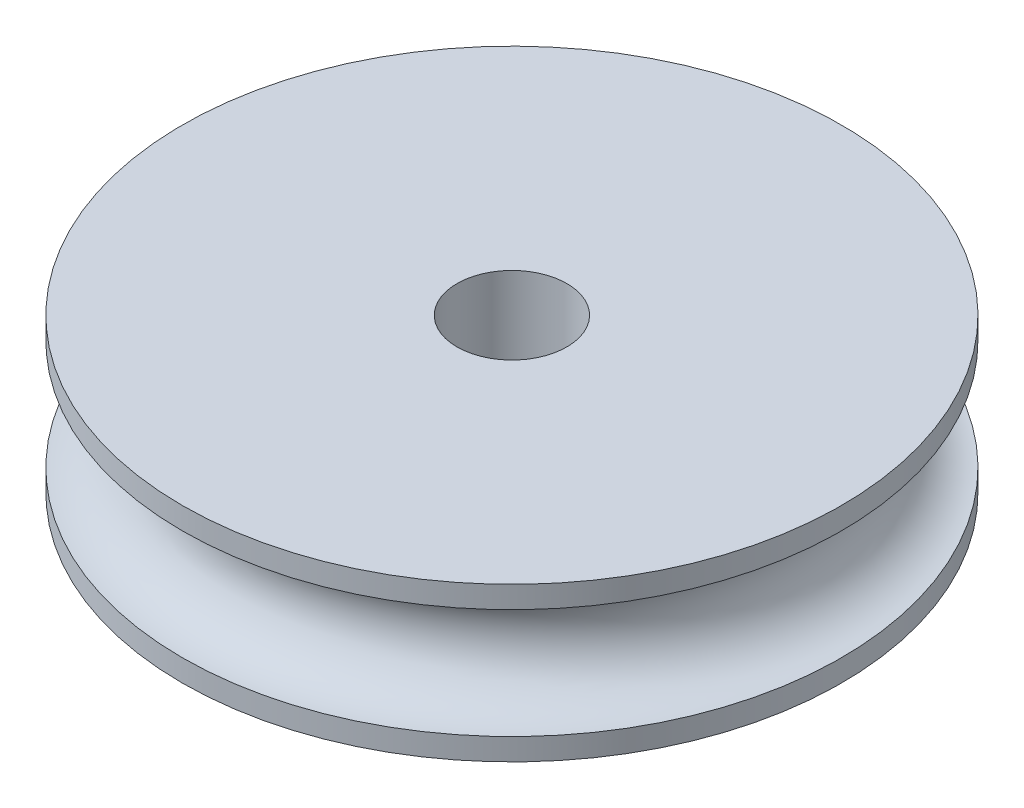
ISO-10303-21;
HEADER;
FILE_DESCRIPTION(('STEP AP214'),'2;1');
FILE_NAME('part.step','',(''),(''),'','','');
FILE_SCHEMA(('AUTOMOTIVE_DESIGN { 1 0 10303 214 1 1 1 1 }'));
ENDSEC;
DATA;
#1=APPLICATION_CONTEXT('core data for automotive mechanical design processes');
#2=APPLICATION_PROTOCOL_DEFINITION('international standard','automotive_design',2000,#1);
#3=PRODUCT_CONTEXT('',#1,'mechanical');
#4=PRODUCT('Part','Part','',(#3));
#5=PRODUCT_RELATED_PRODUCT_CATEGORY('part','',(#4));
#6=PRODUCT_DEFINITION_FORMATION('','',#4);
#7=PRODUCT_DEFINITION_CONTEXT('part definition',#1,'design');
#8=PRODUCT_DEFINITION('design','',#6,#7);
#9=PRODUCT_DEFINITION_SHAPE('','',#8);
#10=(LENGTH_UNIT() NAMED_UNIT(*) SI_UNIT(.MILLI.,.METRE.));
#11=(NAMED_UNIT(*) PLANE_ANGLE_UNIT() SI_UNIT($,.RADIAN.));
#12=(NAMED_UNIT(*) SI_UNIT($,.STERADIAN.) SOLID_ANGLE_UNIT());
#13=UNCERTAINTY_MEASURE_WITH_UNIT(LENGTH_MEASURE(1.E-05),#10,'distance_accuracy_value','');
#14=(GEOMETRIC_REPRESENTATION_CONTEXT(3) GLOBAL_UNCERTAINTY_ASSIGNED_CONTEXT((#13)) GLOBAL_UNIT_ASSIGNED_CONTEXT((#10,
#11,#12)) REPRESENTATION_CONTEXT('',''));
#15=CARTESIAN_POINT('',(0.,0.,0.));
#16=DIRECTION('',(0.,0.,1.));
#17=DIRECTION('',(1.,0.,0.));
#18=AXIS2_PLACEMENT_3D('',#15,#16,#17);
#19=CARTESIAN_POINT('',(0.,0.,0.));
#20=DIRECTION('',(0.,1.,0.));
#21=DIRECTION('',(0.,0.,1.));
#22=AXIS2_PLACEMENT_3D('',#19,#20,#21);
#23=TOROIDAL_SURFACE('',#22,19.05,3.175);
#24=CARTESIAN_POINT('',(0.,-3.175,0.));
#25=DIRECTION('',(0.,1.,0.));
#26=DIRECTION('',(0.,0.,1.));
#27=AXIS2_PLACEMENT_3D('',#24,#25,#26);
#28=CIRCLE('',#27,19.05);
#29=CARTESIAN_POINT('',(0.,-3.175,19.05));
#30=VERTEX_POINT('',#29);
#31=EDGE_CURVE('E45',#30,#30,#28,.T.);
#32=ORIENTED_EDGE('',*,*,#31,.T.);
#33=EDGE_LOOP('',(#32));
#34=FACE_BOUND('',#33,.T.);
#35=CARTESIAN_POINT('',(0.,3.175,0.));
#36=DIRECTION('',(0.,1.,0.));
#37=DIRECTION('',(0.,0.,1.));
#38=AXIS2_PLACEMENT_3D('',#35,#36,#37);
#39=CIRCLE('',#38,19.05);
#40=CARTESIAN_POINT('',(0.,3.175,19.05));
#41=VERTEX_POINT('',#40);
#42=EDGE_CURVE('E10',#41,#41,#39,.T.);
#43=ORIENTED_EDGE('',*,*,#42,.F.);
#44=EDGE_LOOP('',(#43));
#45=FACE_BOUND('',#44,.T.);
#46=ADVANCED_FACE('F31',(#34,#45),#23,.F.);
#47=CARTESIAN_POINT('',(0.,4.445,0.));
#48=DIRECTION('',(0.,1.,0.));
#49=DIRECTION('',(0.,0.,1.));
#50=AXIS2_PLACEMENT_3D('',#47,#48,#49);
#51=CYLINDRICAL_SURFACE('',#50,19.05);
#52=CARTESIAN_POINT('',(0.,4.445,0.));
#53=DIRECTION('',(0.,1.,0.));
#54=DIRECTION('',(0.,0.,1.));
#55=AXIS2_PLACEMENT_3D('',#52,#53,#54);
#56=CIRCLE('',#55,19.05);
#57=CARTESIAN_POINT('',(0.,4.445,19.05));
#58=VERTEX_POINT('',#57);
#59=EDGE_CURVE('E37',#58,#58,#56,.T.);
#60=ORIENTED_EDGE('',*,*,#59,.F.);
#61=EDGE_LOOP('',(#60));
#62=FACE_BOUND('',#61,.T.);
#63=ORIENTED_EDGE('',*,*,#42,.T.);
#64=EDGE_LOOP('',(#63));
#65=FACE_BOUND('',#64,.T.);
#66=ADVANCED_FACE('F69',(#62,#65),#51,.T.);
#67=CARTESIAN_POINT('',(0.,4.445,-26.0178871315126));
#68=DIRECTION('',(0.,1.,0.));
#69=DIRECTION('',(0.,0.,1.));
#70=AXIS2_PLACEMENT_3D('',#67,#68,#69);
#71=PLANE('',#70);
#72=CARTESIAN_POINT('',(0.,4.445,0.));
#73=DIRECTION('',(0.,1.,0.));
#74=DIRECTION('',(0.,0.,1.));
#75=AXIS2_PLACEMENT_3D('',#72,#73,#74);
#76=CIRCLE('',#75,3.175);
#77=CARTESIAN_POINT('',(0.,4.445,3.175));
#78=VERTEX_POINT('',#77);
#79=EDGE_CURVE('E51',#78,#78,#76,.T.);
#80=ORIENTED_EDGE('',*,*,#79,.F.);
#81=EDGE_LOOP('',(#80));
#82=FACE_BOUND('',#81,.T.);
#83=ORIENTED_EDGE('',*,*,#59,.T.);
#84=EDGE_LOOP('',(#83));
#85=FACE_BOUND('',#84,.T.);
#86=ADVANCED_FACE('F67',(#82,#85),#71,.T.);
#87=CARTESIAN_POINT('',(0.,-4.445,-26.0178871315126));
#88=DIRECTION('',(0.,1.,0.));
#89=DIRECTION('',(0.,0.,1.));
#90=AXIS2_PLACEMENT_3D('',#87,#88,#89);
#91=PLANE('',#90);
#92=CARTESIAN_POINT('',(0.,-4.445,0.));
#93=DIRECTION('',(0.,1.,0.));
#94=DIRECTION('',(0.,0.,1.));
#95=AXIS2_PLACEMENT_3D('',#92,#93,#94);
#96=CIRCLE('',#95,3.175);
#97=CARTESIAN_POINT('',(0.,-4.445,3.175));
#98=VERTEX_POINT('',#97);
#99=EDGE_CURVE('E50',#98,#98,#96,.T.);
#100=ORIENTED_EDGE('',*,*,#99,.T.);
#101=EDGE_LOOP('',(#100));
#102=FACE_BOUND('',#101,.T.);
#103=CARTESIAN_POINT('',(0.,-4.445,0.));
#104=DIRECTION('',(0.,1.,0.));
#105=DIRECTION('',(0.,0.,1.));
#106=AXIS2_PLACEMENT_3D('',#103,#104,#105);
#107=CIRCLE('',#106,19.05);
#108=CARTESIAN_POINT('',(0.,-4.445,19.05));
#109=VERTEX_POINT('',#108);
#110=EDGE_CURVE('E41',#109,#109,#107,.T.);
#111=ORIENTED_EDGE('',*,*,#110,.F.);
#112=EDGE_LOOP('',(#111));
#113=FACE_BOUND('',#112,.T.);
#114=ADVANCED_FACE('F57',(#102,#113),#91,.F.);
#115=CARTESIAN_POINT('',(0.,4.445,0.));
#116=DIRECTION('',(0.,1.,0.));
#117=DIRECTION('',(0.,0.,1.));
#118=AXIS2_PLACEMENT_3D('',#115,#116,#117);
#119=CYLINDRICAL_SURFACE('',#118,19.05);
#120=ORIENTED_EDGE('',*,*,#110,.T.);
#121=EDGE_LOOP('',(#120));
#122=FACE_BOUND('',#121,.T.);
#123=ORIENTED_EDGE('',*,*,#31,.F.);
#124=EDGE_LOOP('',(#123));
#125=FACE_BOUND('',#124,.T.);
#126=ADVANCED_FACE('F63',(#122,#125),#119,.T.);
#127=CARTESIAN_POINT('',(0.,-4.445,0.));
#128=DIRECTION('',(0.,1.,0.));
#129=DIRECTION('',(0.,0.,1.));
#130=AXIS2_PLACEMENT_3D('',#127,#128,#129);
#131=CYLINDRICAL_SURFACE('',#130,3.175);
#132=CARTESIAN_POINT('',(0.,-4.445,3.175));
#133=CARTESIAN_POINT('',(0.,-4.35239583333333,3.175));
#134=CARTESIAN_POINT('',(0.,-4.25979166666667,3.175));
#135=CARTESIAN_POINT('',(0.,-4.07458333333333,3.175));
#136=CARTESIAN_POINT('',(0.,-3.98197916666667,3.175));
#137=CARTESIAN_POINT('',(0.,-3.79677083333333,3.175));
#138=CARTESIAN_POINT('',(0.,-3.70416666666667,3.175));
#139=CARTESIAN_POINT('',(0.,-3.51895833333333,3.175));
#140=CARTESIAN_POINT('',(0.,-3.42635416666667,3.175));
#141=CARTESIAN_POINT('',(0.,-3.24114583333333,3.175));
#142=CARTESIAN_POINT('',(0.,-3.14854166666667,3.175));
#143=CARTESIAN_POINT('',(0.,-2.96333333333333,3.175));
#144=CARTESIAN_POINT('',(0.,-2.87072916666667,3.175));
#145=CARTESIAN_POINT('',(0.,-2.68552083333333,3.175));
#146=CARTESIAN_POINT('',(0.,-2.59291666666667,3.175));
#147=CARTESIAN_POINT('',(0.,-2.40770833333333,3.175));
#148=CARTESIAN_POINT('',(0.,-2.31510416666667,3.175));
#149=CARTESIAN_POINT('',(0.,-2.12989583333333,3.175));
#150=CARTESIAN_POINT('',(0.,-2.03729166666667,3.175));
#151=CARTESIAN_POINT('',(0.,-1.85208333333333,3.175));
#152=CARTESIAN_POINT('',(0.,-1.75947916666667,3.175));
#153=CARTESIAN_POINT('',(0.,-1.57427083333333,3.175));
#154=CARTESIAN_POINT('',(0.,-1.48166666666667,3.175));
#155=CARTESIAN_POINT('',(0.,-1.29645833333333,3.175));
#156=CARTESIAN_POINT('',(0.,-1.20385416666667,3.175));
#157=CARTESIAN_POINT('',(0.,-1.01864583333333,3.175));
#158=CARTESIAN_POINT('',(0.,-0.926041666666667,3.175));
#159=CARTESIAN_POINT('',(0.,-0.740833333333333,3.175));
#160=CARTESIAN_POINT('',(0.,-0.648229166666667,3.175));
#161=CARTESIAN_POINT('',(0.,-0.463020833333334,3.175));
#162=CARTESIAN_POINT('',(0.,-0.370416666666667,3.175));
#163=CARTESIAN_POINT('',(0.,-0.185208333333334,3.175));
#164=CARTESIAN_POINT('',(0.,-0.0926041666666676,3.175));
#165=CARTESIAN_POINT('',(0.,0.0926041666666659,3.175));
#166=CARTESIAN_POINT('',(0.,0.185208333333333,3.175));
#167=CARTESIAN_POINT('',(0.,0.370416666666666,3.175));
#168=CARTESIAN_POINT('',(0.,0.463020833333333,3.175));
#169=CARTESIAN_POINT('',(0.,0.648229166666666,3.175));
#170=CARTESIAN_POINT('',(0.,0.740833333333333,3.175));
#171=CARTESIAN_POINT('',(0.,0.926041666666666,3.175));
#172=CARTESIAN_POINT('',(0.,1.01864583333333,3.175));
#173=CARTESIAN_POINT('',(0.,1.20385416666667,3.175));
#174=CARTESIAN_POINT('',(0.,1.29645833333333,3.175));
#175=CARTESIAN_POINT('',(0.,1.48166666666667,3.175));
#176=CARTESIAN_POINT('',(0.,1.57427083333333,3.175));
#177=CARTESIAN_POINT('',(0.,1.75947916666667,3.175));
#178=CARTESIAN_POINT('',(0.,1.85208333333333,3.175));
#179=CARTESIAN_POINT('',(0.,2.03729166666667,3.175));
#180=CARTESIAN_POINT('',(0.,2.12989583333333,3.175));
#181=CARTESIAN_POINT('',(0.,2.31510416666667,3.175));
#182=CARTESIAN_POINT('',(0.,2.40770833333333,3.175));
#183=CARTESIAN_POINT('',(0.,2.59291666666667,3.175));
#184=CARTESIAN_POINT('',(0.,2.68552083333333,3.175));
#185=CARTESIAN_POINT('',(0.,2.87072916666667,3.175));
#186=CARTESIAN_POINT('',(0.,2.96333333333333,3.175));
#187=CARTESIAN_POINT('',(0.,3.14854166666667,3.175));
#188=CARTESIAN_POINT('',(0.,3.24114583333333,3.175));
#189=CARTESIAN_POINT('',(0.,3.42635416666667,3.175));
#190=CARTESIAN_POINT('',(0.,3.51895833333333,3.175));
#191=CARTESIAN_POINT('',(0.,3.70416666666667,3.175));
#192=CARTESIAN_POINT('',(0.,3.79677083333333,3.175));
#193=CARTESIAN_POINT('',(0.,3.98197916666667,3.175));
#194=CARTESIAN_POINT('',(0.,4.07458333333333,3.175));
#195=CARTESIAN_POINT('',(0.,4.25979166666667,3.175));
#196=CARTESIAN_POINT('',(0.,4.35239583333333,3.175));
#197=CARTESIAN_POINT('',(0.,4.445,3.175));
#198=B_SPLINE_CURVE_WITH_KNOTS('',3,(#132,#133,#134,#135,#136,#137,#138,#139,#140,#141,#142,
#143,#144,#145,#146,#147,#148,#149,#150,#151,#152,#153,#154,#155,#156,#157,#158,#159,#160,#161,
#162,#163,#164,#165,#166,#167,#168,#169,#170,#171,#172,#173,#174,#175,#176,#177,#178,#179,#180,
#181,#182,#183,#184,#185,#186,#187,#188,#189,#190,#191,#192,#193,#194,#195,#196,#197),
.UNSPECIFIED.,.F.,.F.,(4,2,2,2,2,2,2,2,2,2,2,2,2,2,2,2,2,2,2,2,2,2,2,2,2,2,2,2,2,2,2,2,4),(0.,
0.2778125,0.555625000000001,0.8334375,1.11125,1.3890625,1.666875,1.9446875,2.2225,2.5003125,
2.778125,3.0559375,3.33375,3.6115625,3.889375,4.1671875,4.445,4.7228125,5.000625,5.2784375,
5.55625,5.8340625,6.111875,6.3896875,6.6675,6.9453125,7.223125,7.5009375,7.77875,8.0565625,
8.334375,8.6121875,8.89),.UNSPECIFIED.);
#199=EDGE_CURVE('BSEAM60',#98,#78,#198,.T.);
#200=ORIENTED_EDGE('',*,*,#99,.F.);
#201=ORIENTED_EDGE('',*,*,#79,.T.);
#202=ORIENTED_EDGE('',*,*,#199,.T.);
#203=ORIENTED_EDGE('',*,*,#199,.F.);
#204=EDGE_LOOP('',(#200,#202,#201,#203));
#205=FACE_BOUND('',#204,.T.);
#206=ADVANCED_FACE('F60',(#205),#131,.F.);
#207=CLOSED_SHELL('',(#46,#66,#86,#114,#126,#206));
#208=MANIFOLD_SOLID_BREP('B2',#207);
#209=ADVANCED_BREP_SHAPE_REPRESENTATION('',(#18,#208),#14);
#210=SHAPE_DEFINITION_REPRESENTATION(#9,#209);
ENDSEC;
END-ISO-10303-21;
